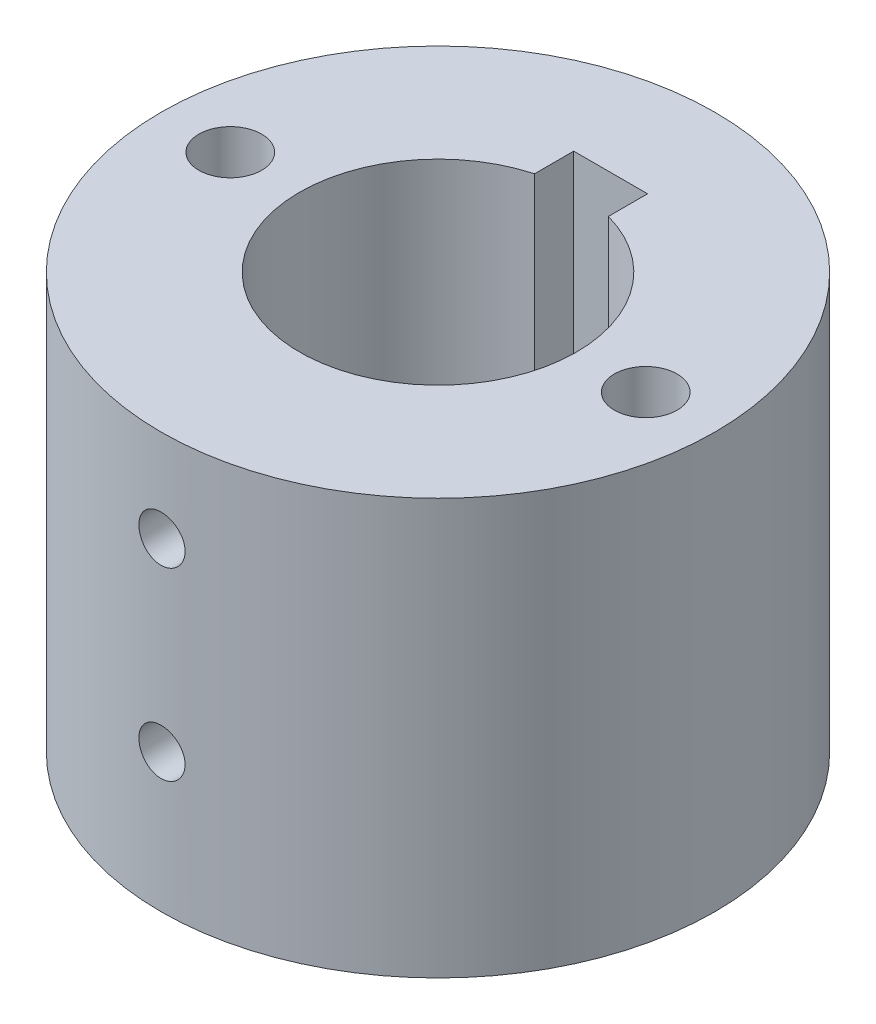
ISO-10303-21;
HEADER;
FILE_DESCRIPTION(('STEP AP214'),'2;1');
FILE_NAME('part.step','',(''),(''),'','','');
FILE_SCHEMA(('AUTOMOTIVE_DESIGN { 1 0 10303 214 1 1 1 1 }'));
ENDSEC;
DATA;
#1=APPLICATION_CONTEXT('core data for automotive mechanical design processes');
#2=APPLICATION_PROTOCOL_DEFINITION('international standard','automotive_design',2000,#1);
#3=PRODUCT_CONTEXT('',#1,'mechanical');
#4=PRODUCT('Part','Part','',(#3));
#5=PRODUCT_RELATED_PRODUCT_CATEGORY('part','',(#4));
#6=PRODUCT_DEFINITION_FORMATION('','',#4);
#7=PRODUCT_DEFINITION_CONTEXT('part definition',#1,'design');
#8=PRODUCT_DEFINITION('design','',#6,#7);
#9=PRODUCT_DEFINITION_SHAPE('','',#8);
#10=(LENGTH_UNIT() NAMED_UNIT(*) SI_UNIT(.MILLI.,.METRE.));
#11=(NAMED_UNIT(*) PLANE_ANGLE_UNIT() SI_UNIT($,.RADIAN.));
#12=(NAMED_UNIT(*) SI_UNIT($,.STERADIAN.) SOLID_ANGLE_UNIT());
#13=UNCERTAINTY_MEASURE_WITH_UNIT(LENGTH_MEASURE(1.E-05),#10,'distance_accuracy_value','');
#14=(GEOMETRIC_REPRESENTATION_CONTEXT(3) GLOBAL_UNCERTAINTY_ASSIGNED_CONTEXT((#13)) GLOBAL_UNIT_ASSIGNED_CONTEXT((#10,
#11,#12)) REPRESENTATION_CONTEXT('',''));
#15=CARTESIAN_POINT('',(0.,0.,0.));
#16=DIRECTION('',(0.,0.,1.));
#17=DIRECTION('',(1.,0.,0.));
#18=AXIS2_PLACEMENT_3D('',#15,#16,#17);
#19=CARTESIAN_POINT('',(0.,45.,0.));
#20=DIRECTION('',(0.,1.,0.));
#21=DIRECTION('',(0.,0.,1.));
#22=AXIS2_PLACEMENT_3D('',#19,#20,#21);
#23=PLANE('',#22);
#24=DIRECTION('',(0.,0.,-1.));
#25=VECTOR('',#24,1.);
#26=CARTESIAN_POINT('',(4.,45.,-18.7));
#27=LINE('',#26,#25);
#28=CARTESIAN_POINT('',(4.,45.,-14.456832294801));
#29=VERTEX_POINT('',#28);
#30=CARTESIAN_POINT('',(4.,45.,-18.7));
#31=VERTEX_POINT('',#30);
#32=EDGE_CURVE('E86',#29,#31,#27,.T.);
#33=ORIENTED_EDGE('',*,*,#32,.F.);
#34=CARTESIAN_POINT('',(0.,45.,0.));
#35=DIRECTION('',(0.,1.,0.));
#36=DIRECTION('',(0.,0.,1.));
#37=AXIS2_PLACEMENT_3D('',#34,#35,#36);
#38=CIRCLE('',#37,15.);
#39=CARTESIAN_POINT('',(-4.,45.,-14.456832294801));
#40=VERTEX_POINT('',#39);
#41=EDGE_CURVE('E181',#40,#29,#38,.T.);
#42=ORIENTED_EDGE('',*,*,#41,.F.);
#43=DIRECTION('',(0.,0.,1.));
#44=VECTOR('',#43,1.);
#45=CARTESIAN_POINT('',(-4.,45.,-18.7));
#46=LINE('',#45,#44);
#47=CARTESIAN_POINT('',(-4.,45.,-18.7));
#48=VERTEX_POINT('',#47);
#49=EDGE_CURVE('E57',#48,#40,#46,.T.);
#50=ORIENTED_EDGE('',*,*,#49,.F.);
#51=DIRECTION('',(-1.,0.,0.));
#52=VECTOR('',#51,1.);
#53=CARTESIAN_POINT('',(-4.,45.,-18.7));
#54=LINE('',#53,#52);
#55=EDGE_CURVE('E104',#31,#48,#54,.T.);
#56=ORIENTED_EDGE('',*,*,#55,.F.);
#57=EDGE_LOOP('',(#33,#42,#50,#56));
#58=FACE_BOUND('',#57,.T.);
#59=CARTESIAN_POINT('',(22.5,45.,0.));
#60=DIRECTION('',(0.,1.,0.));
#61=DIRECTION('',(0.,0.,1.));
#62=AXIS2_PLACEMENT_3D('',#59,#60,#61);
#63=CIRCLE('',#62,3.4);
#64=CARTESIAN_POINT('',(22.5,45.,3.4));
#65=VERTEX_POINT('',#64);
#66=EDGE_CURVE('E194',#65,#65,#63,.T.);
#67=ORIENTED_EDGE('',*,*,#66,.F.);
#68=EDGE_LOOP('',(#67));
#69=FACE_BOUND('',#68,.T.);
#70=CARTESIAN_POINT('',(-22.5,45.,0.));
#71=DIRECTION('',(0.,1.,0.));
#72=DIRECTION('',(0.,0.,1.));
#73=AXIS2_PLACEMENT_3D('',#70,#71,#72);
#74=CIRCLE('',#73,3.4);
#75=CARTESIAN_POINT('',(-22.5,45.,3.4));
#76=VERTEX_POINT('',#75);
#77=EDGE_CURVE('E191',#76,#76,#74,.T.);
#78=ORIENTED_EDGE('',*,*,#77,.F.);
#79=EDGE_LOOP('',(#78));
#80=FACE_BOUND('',#79,.T.);
#81=CARTESIAN_POINT('',(0.,45.,0.));
#82=DIRECTION('',(0.,1.,0.));
#83=DIRECTION('',(0.,0.,1.));
#84=AXIS2_PLACEMENT_3D('',#81,#82,#83);
#85=CIRCLE('',#84,30.);
#86=CARTESIAN_POINT('',(0.,45.,30.));
#87=VERTEX_POINT('',#86);
#88=EDGE_CURVE('E178',#87,#87,#85,.T.);
#89=ORIENTED_EDGE('',*,*,#88,.T.);
#90=EDGE_LOOP('',(#89));
#91=FACE_BOUND('',#90,.T.);
#92=ADVANCED_FACE('F41',(#58,#69,#80,#91),#23,.T.);
#93=CARTESIAN_POINT('',(0.,0.,0.));
#94=DIRECTION('',(0.,1.,0.));
#95=DIRECTION('',(0.,0.,1.));
#96=AXIS2_PLACEMENT_3D('',#93,#94,#95);
#97=PLANE('',#96);
#98=CARTESIAN_POINT('',(0.,0.,0.));
#99=DIRECTION('',(0.,1.,0.));
#100=DIRECTION('',(0.,0.,1.));
#101=AXIS2_PLACEMENT_3D('',#98,#99,#100);
#102=CIRCLE('',#101,15.);
#103=CARTESIAN_POINT('',(-4.,0.,-14.456832294801));
#104=VERTEX_POINT('',#103);
#105=CARTESIAN_POINT('',(4.,0.,-14.456832294801));
#106=VERTEX_POINT('',#105);
#107=EDGE_CURVE('E102',#104,#106,#102,.T.);
#108=ORIENTED_EDGE('',*,*,#107,.T.);
#109=DIRECTION('',(0.,0.,-1.));
#110=VECTOR('',#109,1.);
#111=CARTESIAN_POINT('',(4.,0.,-18.7));
#112=LINE('',#111,#110);
#113=CARTESIAN_POINT('',(4.,0.,-18.7));
#114=VERTEX_POINT('',#113);
#115=EDGE_CURVE('E83',#106,#114,#112,.T.);
#116=ORIENTED_EDGE('',*,*,#115,.T.);
#117=DIRECTION('',(-1.,0.,0.));
#118=VECTOR('',#117,1.);
#119=CARTESIAN_POINT('',(-4.,0.,-18.7));
#120=LINE('',#119,#118);
#121=CARTESIAN_POINT('',(-4.,0.,-18.7));
#122=VERTEX_POINT('',#121);
#123=EDGE_CURVE('E94',#114,#122,#120,.T.);
#124=ORIENTED_EDGE('',*,*,#123,.T.);
#125=DIRECTION('',(0.,0.,1.));
#126=VECTOR('',#125,1.);
#127=CARTESIAN_POINT('',(-4.,0.,-18.7));
#128=LINE('',#127,#126);
#129=EDGE_CURVE('E91',#122,#104,#128,.T.);
#130=ORIENTED_EDGE('',*,*,#129,.T.);
#131=EDGE_LOOP('',(#108,#116,#124,#130));
#132=FACE_BOUND('',#131,.T.);
#133=CARTESIAN_POINT('',(0.,0.,0.));
#134=DIRECTION('',(0.,1.,0.));
#135=DIRECTION('',(0.,0.,1.));
#136=AXIS2_PLACEMENT_3D('',#133,#134,#135);
#137=CIRCLE('',#136,30.);
#138=CARTESIAN_POINT('',(0.,0.,30.));
#139=VERTEX_POINT('',#138);
#140=EDGE_CURVE('E145',#139,#139,#137,.T.);
#141=ORIENTED_EDGE('',*,*,#140,.F.);
#142=EDGE_LOOP('',(#141));
#143=FACE_BOUND('',#142,.T.);
#144=ADVANCED_FACE('F99',(#132,#143),#97,.F.);
#145=CARTESIAN_POINT('',(0.,45.,0.));
#146=DIRECTION('',(0.,-1.,0.));
#147=DIRECTION('',(0.,0.,-1.));
#148=AXIS2_PLACEMENT_3D('',#145,#146,#147);
#149=CYLINDRICAL_SURFACE('',#148,30.);
#150=CARTESIAN_POINT('',(2.5,35.,29.8956518577535));
#151=CARTESIAN_POINT('',(2.49999387707595,34.859835728024,29.895653240209));
#152=CARTESIAN_POINT('',(2.48817272989955,34.7195760346058,29.8966481995655));
#153=CARTESIAN_POINT('',(2.44118994768572,34.4429374491414,29.9005204937316));
#154=CARTESIAN_POINT('',(2.40600186590414,34.306563137181,29.9033999613783));
#155=CARTESIAN_POINT('',(2.31330996184382,34.0417420096867,29.9107128874002));
#156=CARTESIAN_POINT('',(2.25581879093882,33.9132907476126,29.9151454646401));
#157=CARTESIAN_POINT('',(2.12017517121364,33.6678920119752,29.9250640675404));
#158=CARTESIAN_POINT('',(2.04202713953173,33.5509420863624,29.9305498679176));
#159=CARTESIAN_POINT('',(1.86707134114509,33.3315349923334,29.9419726194871));
#160=CARTESIAN_POINT('',(1.77022150350469,33.2291114203426,29.9479105692257));
#161=CARTESIAN_POINT('',(1.56070030169023,33.0419530844049,29.9595594152693));
#162=CARTESIAN_POINT('',(1.44802824663419,32.957219093281,29.9652703016456));
#163=CARTESIAN_POINT('',(1.20986061327197,32.8077334633595,29.9758310126879));
#164=CARTESIAN_POINT('',(1.08434673031465,32.7430108920464,29.9806795804987));
#165=CARTESIAN_POINT('',(0.824186001246905,32.6355712722038,29.9889585943072));
#166=CARTESIAN_POINT('',(0.689539315040404,32.5928538385045,29.9923890651266));
#167=CARTESIAN_POINT('',(0.415269489869528,32.5307337903599,29.9974383863167));
#168=CARTESIAN_POINT('',(0.275658740580804,32.5112768222014,29.9990614594988));
#169=CARTESIAN_POINT('',(-0.00485570472454915,32.4960619920385,30.0003274183556));
#170=CARTESIAN_POINT('',(-0.145759376648873,32.5003036893252,29.999970340854));
#171=CARTESIAN_POINT('',(-0.424491378797039,32.5323213304484,29.9973197159698));
#172=CARTESIAN_POINT('',(-0.562326475181168,32.5600388245105,29.9950309780632));
#173=CARTESIAN_POINT('',(-0.831381165100617,32.6381303774052,29.9887799963655));
#174=CARTESIAN_POINT('',(-0.96260069567876,32.6885046518064,29.9848177366516));
#175=CARTESIAN_POINT('',(-1.21488540159214,32.8105449677964,29.9756571978073));
#176=CARTESIAN_POINT('',(-1.33593785664744,32.8822371864969,29.9704574006341));
#177=CARTESIAN_POINT('',(-1.56431333969343,33.0448593039466,29.9594061317313));
#178=CARTESIAN_POINT('',(-1.67163608912468,33.135789592914,29.9535546467843));
#179=CARTESIAN_POINT('',(-1.86984741195474,33.3346360998881,29.9418366186817));
#180=CARTESIAN_POINT('',(-1.96068504166257,33.442603107047,29.9359700838166));
#181=CARTESIAN_POINT('',(-2.12295399730677,33.6722812627908,29.9249010443095));
#182=CARTESIAN_POINT('',(-2.19438530724579,33.7939924227054,29.9196985402148));
#183=CARTESIAN_POINT('',(-2.31581201148313,34.0477397194295,29.9105456524246));
#184=CARTESIAN_POINT('',(-2.36580476183676,34.1797771273672,29.9065954231836));
#185=CARTESIAN_POINT('',(-2.44289751757127,34.4504117951275,29.9003973319995));
#186=CARTESIAN_POINT('',(-2.46999800423701,34.5890089169745,29.898149434267));
#187=CARTESIAN_POINT('',(-2.50047245728154,34.8683829663882,29.8956163224134));
#188=CARTESIAN_POINT('',(-2.50391746529472,35.0091520936172,29.895325231706));
#189=CARTESIAN_POINT('',(-2.48716926261205,35.2892658591241,29.8967231803454));
#190=CARTESIAN_POINT('',(-2.46697627239705,35.4286105106764,29.898412201223));
#191=CARTESIAN_POINT('',(-2.4035845031062,35.7017158894989,29.9035747036187));
#192=CARTESIAN_POINT('',(-2.36041887747363,35.8354843649077,29.9070456133118));
#193=CARTESIAN_POINT('',(-2.2523408555746,36.0938802054094,29.9153786744903));
#194=CARTESIAN_POINT('',(-2.18742811036767,36.2185074237882,29.9202408482989));
#195=CARTESIAN_POINT('',(-2.03751871994737,36.4554081305482,29.9308228365796));
#196=CARTESIAN_POINT('',(-1.95247473421259,36.5676515709961,29.9365446608352));
#197=CARTESIAN_POINT('',(-1.76478532103877,36.7762948522671,29.9481944443445));
#198=CARTESIAN_POINT('',(-1.66213959072317,36.8726944204058,29.9541224071439));
#199=CARTESIAN_POINT('',(-1.44185343227936,37.0471560144251,29.9655340277207));
#200=CARTESIAN_POINT('',(-1.32417638102458,37.1251718825078,29.9710165449519));
#201=CARTESIAN_POINT('',(-1.07735048303601,37.2603347839114,29.9809030967764));
#202=CARTESIAN_POINT('',(-0.94820175095444,37.3174820257718,29.9853071421468));
#203=CARTESIAN_POINT('',(-0.682263946917593,37.4092062060402,29.9925352804838));
#204=CARTESIAN_POINT('',(-0.545484776301513,37.4438116878646,29.9953613708791));
#205=CARTESIAN_POINT('',(-0.268032947665744,37.4895633143852,29.9991232832458));
#206=CARTESIAN_POINT('',(-0.127360363394569,37.5007099031289,30.0000591409968));
#207=CARTESIAN_POINT('',(0.153430120989758,37.4992221509976,29.9999351968345));
#208=CARTESIAN_POINT('',(0.293548410528468,37.4866597454036,29.9988814316171));
#209=CARTESIAN_POINT('',(0.569677780153337,37.4382606137212,29.9949085848886));
#210=CARTESIAN_POINT('',(0.705688854660704,37.4024238560207,29.9919895008438));
#211=CARTESIAN_POINT('',(0.969747616121882,37.3085115746941,29.9846135425984));
#212=CARTESIAN_POINT('',(1.09779576530065,37.2504373432926,29.9801567577553));
#213=CARTESIAN_POINT('',(1.34233643224756,37.1137068865058,29.9702039990198));
#214=CARTESIAN_POINT('',(1.45882913271515,37.035050986602,29.9647080415613));
#215=CARTESIAN_POINT('',(1.67732022356365,36.8591199628773,29.9532739625408));
#216=CARTESIAN_POINT('',(1.77927568996154,36.7617916116336,29.9473346073371));
#217=CARTESIAN_POINT('',(1.96544456639886,36.5513745781851,29.9356936245053));
#218=CARTESIAN_POINT('',(2.04965367362058,36.4382820847928,29.9299920547994));
#219=CARTESIAN_POINT('',(2.19805344744714,36.1993274982476,29.9194606102169));
#220=CARTESIAN_POINT('',(2.26220630864616,36.0734418749969,29.9146323887052));
#221=CARTESIAN_POINT('',(2.36838225233449,35.8127314081635,29.9064144901315));
#222=CARTESIAN_POINT('',(2.41043077732367,35.6779170439569,29.9030231600575));
#223=CARTESIAN_POINT('',(2.46049524501522,35.451922789432,29.8989352047016));
#224=CARTESIAN_POINT('',(2.47528983514609,35.3621963680536,29.8977096097263));
#225=CARTESIAN_POINT('',(2.49504418376665,35.1816599920629,29.8960674893075));
#226=CARTESIAN_POINT('',(2.50000396868538,35.090850040363,29.8956509616896));
#227=CARTESIAN_POINT('',(2.5,35.,29.8956518577535));
#228=B_SPLINE_CURVE_WITH_KNOTS('',3,(#150,#151,#152,#153,#154,#155,#156,#157,#158,#159,#160,
#161,#162,#163,#164,#165,#166,#167,#168,#169,#170,#171,#172,#173,#174,#175,#176,#177,#178,#179,
#180,#181,#182,#183,#184,#185,#186,#187,#188,#189,#190,#191,#192,#193,#194,#195,#196,#197,#198,
#199,#200,#201,#202,#203,#204,#205,#206,#207,#208,#209,#210,#211,#212,#213,#214,#215,#216,#217,
#218,#219,#220,#221,#222,#223,#224,#225,#226,#227),.UNSPECIFIED.,.T.,.F.,(4,2,2,2,2,2,2,2,2,2,2,
2,2,2,2,2,2,2,2,2,2,2,2,2,2,2,2,2,2,2,2,2,2,2,2,2,2,2,4),(0.,0.420161105126486,
0.840798561792934,1.26119776094298,1.68150713708956,2.10277327972937,2.52405782280752,
2.94595145651181,3.36783770529444,3.78873617555057,4.20962681865261,4.62947260311709,
5.04932238229939,5.46968985502513,5.89006585515619,6.31171960057015,6.73337369356767,
7.15507977278702,7.57677698587607,7.99720721074768,8.4176335141337,8.83745470924517,
9.25728264086364,9.67810782107513,10.0989402432321,10.5208182934246,10.9426921276866,
11.3640307220251,11.7853613408799,12.2054156584349,12.62547054652,13.0455010288207,
13.4655248690968,13.8867643080924,14.3081057644345,14.7302367134679,15.1518807121846,
15.42421656069,15.6965516773469),.UNSPECIFIED.);
#229=CARTESIAN_POINT('',(2.5,35.,29.8956518577535));
#230=VERTEX_POINT('',#229);
#231=EDGE_CURVE('E120',#230,#230,#228,.T.);
#232=ORIENTED_EDGE('',*,*,#231,.T.);
#233=EDGE_LOOP('',(#232));
#234=FACE_BOUND('',#233,.T.);
#235=CARTESIAN_POINT('',(2.5,15.,29.8956518577535));
#236=CARTESIAN_POINT('',(2.49999387707595,14.859835728024,29.895653240209));
#237=CARTESIAN_POINT('',(2.48817272989955,14.7195760346058,29.8966481995655));
#238=CARTESIAN_POINT('',(2.44118994768572,14.4429374491414,29.9005204937316));
#239=CARTESIAN_POINT('',(2.40600186590414,14.306563137181,29.9033999613783));
#240=CARTESIAN_POINT('',(2.31330996184382,14.0417420096867,29.9107128874002));
#241=CARTESIAN_POINT('',(2.25581879093882,13.9132907476126,29.9151454646401));
#242=CARTESIAN_POINT('',(2.12017517121364,13.6678920119752,29.9250640675404));
#243=CARTESIAN_POINT('',(2.04202713953173,13.5509420863624,29.9305498679176));
#244=CARTESIAN_POINT('',(1.86707134114509,13.3315349923334,29.9419726194871));
#245=CARTESIAN_POINT('',(1.77022150350469,13.2291114203426,29.9479105692257));
#246=CARTESIAN_POINT('',(1.56070030169023,13.0419530844049,29.9595594152693));
#247=CARTESIAN_POINT('',(1.44802824663419,12.957219093281,29.9652703016456));
#248=CARTESIAN_POINT('',(1.20986061327197,12.8077334633595,29.9758310126879));
#249=CARTESIAN_POINT('',(1.08434673031465,12.7430108920464,29.9806795804987));
#250=CARTESIAN_POINT('',(0.824186001246906,12.6355712722038,29.9889585943072));
#251=CARTESIAN_POINT('',(0.689539315040403,12.5928538385045,29.9923890651266));
#252=CARTESIAN_POINT('',(0.415269489869526,12.5307337903599,29.9974383863167));
#253=CARTESIAN_POINT('',(0.275658740580803,12.5112768222014,29.9990614594988));
#254=CARTESIAN_POINT('',(-0.00485570472454866,12.4960619920385,30.0003274183556));
#255=CARTESIAN_POINT('',(-0.145759376648872,12.5003036893252,29.999970340854));
#256=CARTESIAN_POINT('',(-0.424491378797037,12.5323213304484,29.9973197159698));
#257=CARTESIAN_POINT('',(-0.562326475181165,12.5600388245105,29.9950309780632));
#258=CARTESIAN_POINT('',(-0.831381165100614,12.6381303774052,29.9887799963655));
#259=CARTESIAN_POINT('',(-0.962600695678757,12.6885046518064,29.9848177366516));
#260=CARTESIAN_POINT('',(-1.21488540159214,12.8105449677964,29.9756571978073));
#261=CARTESIAN_POINT('',(-1.33593785664744,12.8822371864969,29.9704574006341));
#262=CARTESIAN_POINT('',(-1.56431333969343,13.0448593039465,29.9594061317313));
#263=CARTESIAN_POINT('',(-1.67163608912468,13.135789592914,29.9535546467843));
#264=CARTESIAN_POINT('',(-1.86984741195474,13.3346360998881,29.9418366186817));
#265=CARTESIAN_POINT('',(-1.96068504166257,13.442603107047,29.9359700838166));
#266=CARTESIAN_POINT('',(-2.12295399730676,13.6722812627908,29.9249010443095));
#267=CARTESIAN_POINT('',(-2.19438530724579,13.7939924227054,29.9196985402148));
#268=CARTESIAN_POINT('',(-2.31581201148313,14.0477397194295,29.9105456524246));
#269=CARTESIAN_POINT('',(-2.36580476183675,14.1797771273672,29.9065954231836));
#270=CARTESIAN_POINT('',(-2.44289751757127,14.4504117951275,29.9003973319995));
#271=CARTESIAN_POINT('',(-2.46999800423701,14.5890089169745,29.898149434267));
#272=CARTESIAN_POINT('',(-2.50047245728154,14.8683829663882,29.8956163224134));
#273=CARTESIAN_POINT('',(-2.50391746529472,15.0091520936172,29.895325231706));
#274=CARTESIAN_POINT('',(-2.48716926261205,15.2892658591241,29.8967231803454));
#275=CARTESIAN_POINT('',(-2.46697627239705,15.4286105106764,29.898412201223));
#276=CARTESIAN_POINT('',(-2.4035845031062,15.7017158894989,29.9035747036187));
#277=CARTESIAN_POINT('',(-2.36041887747363,15.8354843649077,29.9070456133118));
#278=CARTESIAN_POINT('',(-2.2523408555746,16.0938802054094,29.9153786744903));
#279=CARTESIAN_POINT('',(-2.18742811036767,16.2185074237882,29.9202408482989));
#280=CARTESIAN_POINT('',(-2.03751871994737,16.4554081305482,29.9308228365796));
#281=CARTESIAN_POINT('',(-1.95247473421259,16.5676515709961,29.9365446608352));
#282=CARTESIAN_POINT('',(-1.76478532103877,16.7762948522671,29.9481944443445));
#283=CARTESIAN_POINT('',(-1.66213959072317,16.8726944204058,29.9541224071439));
#284=CARTESIAN_POINT('',(-1.44185343227936,17.0471560144251,29.9655340277207));
#285=CARTESIAN_POINT('',(-1.32417638102457,17.1251718825078,29.9710165449519));
#286=CARTESIAN_POINT('',(-1.07735048303601,17.2603347839114,29.9809030967764));
#287=CARTESIAN_POINT('',(-0.94820175095444,17.3174820257718,29.9853071421468));
#288=CARTESIAN_POINT('',(-0.682263946917595,17.4092062060402,29.9925352804838));
#289=CARTESIAN_POINT('',(-0.545484776301515,17.4438116878646,29.9953613708791));
#290=CARTESIAN_POINT('',(-0.268032947665747,17.4895633143852,29.9991232832458));
#291=CARTESIAN_POINT('',(-0.127360363394571,17.5007099031289,30.0000591409968));
#292=CARTESIAN_POINT('',(0.153430120989756,17.4992221509976,29.9999351968345));
#293=CARTESIAN_POINT('',(0.293548410528466,17.4866597454036,29.9988814316171));
#294=CARTESIAN_POINT('',(0.569677780153335,17.4382606137212,29.9949085848886));
#295=CARTESIAN_POINT('',(0.705688854660703,17.4024238560207,29.9919895008438));
#296=CARTESIAN_POINT('',(0.969747616121879,17.3085115746941,29.9846135425984));
#297=CARTESIAN_POINT('',(1.09779576530065,17.2504373432926,29.9801567577553));
#298=CARTESIAN_POINT('',(1.34233643224755,17.1137068865058,29.9702039990198));
#299=CARTESIAN_POINT('',(1.45882913271514,17.035050986602,29.9647080415613));
#300=CARTESIAN_POINT('',(1.67732022356365,16.8591199628773,29.9532739625408));
#301=CARTESIAN_POINT('',(1.77927568996154,16.7617916116336,29.9473346073371));
#302=CARTESIAN_POINT('',(1.96544456639886,16.5513745781851,29.9356936245053));
#303=CARTESIAN_POINT('',(2.04965367362057,16.4382820847928,29.9299920547994));
#304=CARTESIAN_POINT('',(2.19805344744714,16.1993274982476,29.9194606102169));
#305=CARTESIAN_POINT('',(2.26220630864616,16.0734418749969,29.9146323887052));
#306=CARTESIAN_POINT('',(2.36838225233449,15.8127314081635,29.9064144901315));
#307=CARTESIAN_POINT('',(2.41043077732367,15.6779170439569,29.9030231600575));
#308=CARTESIAN_POINT('',(2.46049524501522,15.451922789432,29.8989352047016));
#309=CARTESIAN_POINT('',(2.47528983514609,15.3621963680536,29.8977096097263));
#310=CARTESIAN_POINT('',(2.49504418376665,15.1816599920629,29.8960674893075));
#311=CARTESIAN_POINT('',(2.50000396868538,15.090850040363,29.8956509616896));
#312=CARTESIAN_POINT('',(2.5,15.,29.8956518577535));
#313=B_SPLINE_CURVE_WITH_KNOTS('',3,(#235,#236,#237,#238,#239,#240,#241,#242,#243,#244,#245,
#246,#247,#248,#249,#250,#251,#252,#253,#254,#255,#256,#257,#258,#259,#260,#261,#262,#263,#264,
#265,#266,#267,#268,#269,#270,#271,#272,#273,#274,#275,#276,#277,#278,#279,#280,#281,#282,#283,
#284,#285,#286,#287,#288,#289,#290,#291,#292,#293,#294,#295,#296,#297,#298,#299,#300,#301,#302,
#303,#304,#305,#306,#307,#308,#309,#310,#311,#312),.UNSPECIFIED.,.T.,.F.,(4,2,2,2,2,2,2,2,2,2,2,
2,2,2,2,2,2,2,2,2,2,2,2,2,2,2,2,2,2,2,2,2,2,2,2,2,2,2,4),(0.,0.420161105126486,
0.840798561792932,1.26119776094298,1.68150713708956,2.10277327972937,2.52405782280752,
2.94595145651181,3.36783770529444,3.78873617555057,4.20962681865261,4.62947260311708,
5.04932238229939,5.46968985502513,5.89006585515619,6.31171960057014,6.73337369356767,
7.15507977278701,7.57677698587607,7.99720721074768,8.4176335141337,8.83745470924516,
9.25728264086363,9.67810782107513,10.0989402432321,10.5208182934246,10.9426921276866,
11.3640307220251,11.7853613408799,12.2054156584349,12.62547054652,13.0455010288207,
13.4655248690968,13.8867643080923,14.3081057644345,14.7302367134679,15.1518807121846,
15.42421656069,15.6965516773468),.UNSPECIFIED.);
#314=CARTESIAN_POINT('',(2.5,15.,29.8956518577535));
#315=VERTEX_POINT('',#314);
#316=EDGE_CURVE('E112',#315,#315,#313,.T.);
#317=ORIENTED_EDGE('',*,*,#316,.T.);
#318=EDGE_LOOP('',(#317));
#319=FACE_BOUND('',#318,.T.);
#320=ORIENTED_EDGE('',*,*,#88,.F.);
#321=EDGE_LOOP('',(#320));
#322=FACE_BOUND('',#321,.T.);
#323=ORIENTED_EDGE('',*,*,#140,.T.);
#324=EDGE_LOOP('',(#323));
#325=FACE_BOUND('',#324,.T.);
#326=ADVANCED_FACE('F43',(#234,#319,#322,#325),#149,.T.);
#327=CARTESIAN_POINT('',(0.,45.,0.));
#328=DIRECTION('',(0.,-1.,0.));
#329=DIRECTION('',(0.,0.,-1.));
#330=AXIS2_PLACEMENT_3D('',#327,#328,#329);
#331=CYLINDRICAL_SURFACE('',#330,15.);
#332=DIRECTION('',(0.,-1.,0.));
#333=VECTOR('',#332,1.);
#334=CARTESIAN_POINT('',(4.,45.,-14.456832294801));
#335=LINE('',#334,#333);
#336=EDGE_CURVE('E11',#106,#29,#335,.F.);
#337=ORIENTED_EDGE('',*,*,#336,.F.);
#338=ORIENTED_EDGE('',*,*,#107,.F.);
#339=DIRECTION('',(0.,-1.,0.));
#340=VECTOR('',#339,1.);
#341=CARTESIAN_POINT('',(-4.,45.,-14.456832294801));
#342=LINE('',#341,#340);
#343=EDGE_CURVE('E50',#40,#104,#342,.T.);
#344=ORIENTED_EDGE('',*,*,#343,.F.);
#345=ORIENTED_EDGE('',*,*,#41,.T.);
#346=EDGE_LOOP('',(#337,#338,#344,#345));
#347=FACE_BOUND('',#346,.T.);
#348=CARTESIAN_POINT('',(2.5,35.,14.790199457749));
#349=CARTESIAN_POINT('',(2.49999439841983,34.8606242518382,14.790201973666));
#350=CARTESIAN_POINT('',(2.48830516902828,34.7211723939285,14.7921909238523));
#351=CARTESIAN_POINT('',(2.44187742806638,34.4461814567368,14.7999245720004));
#352=CARTESIAN_POINT('',(2.40711766030861,34.3106461062419,14.8056727334637));
#353=CARTESIAN_POINT('',(2.31562954367049,34.0475077166584,14.8202560936731));
#354=CARTESIAN_POINT('',(2.25891955493198,33.9198981513378,14.8290887118401));
#355=CARTESIAN_POINT('',(2.12518649688947,33.6760190452822,14.8488427210228));
#356=CARTESIAN_POINT('',(2.04816571350133,33.5597482304227,14.8597638769423));
#357=CARTESIAN_POINT('',(1.87518752696654,33.3406871502554,14.8825847115588));
#358=CARTESIAN_POINT('',(1.77906904893234,33.2380248686138,14.8944921732795));
#359=CARTESIAN_POINT('',(1.57097200469527,33.0502066931382,14.9178748066858));
#360=CARTESIAN_POINT('',(1.45899249914997,32.9650518368846,14.9293499527174));
#361=CARTESIAN_POINT('',(1.22152286994835,32.8141854327807,14.9506573698271));
#362=CARTESIAN_POINT('',(1.09595608145671,32.7485929922682,14.9604794243234));
#363=CARTESIAN_POINT('',(0.835395621723866,32.6394789294694,14.9772873695709));
#364=CARTESIAN_POINT('',(0.700402564078186,32.5959558721151,14.9842734447266));
#365=CARTESIAN_POINT('',(0.426143726344241,32.5326074650161,14.994567347244));
#366=CARTESIAN_POINT('',(0.286928886679269,32.5125670839953,14.9979085311091));
#367=CARTESIAN_POINT('',(0.00707528552579606,32.4960842458474,15.0006507934278));
#368=CARTESIAN_POINT('',(-0.133563378528899,32.4996401847528,15.0000521396931));
#369=CARTESIAN_POINT('',(-0.410802185078875,32.5300813515282,14.9950085843139));
#370=CARTESIAN_POINT('',(-0.547428530700139,32.5567351634092,14.990601836924));
#371=CARTESIAN_POINT('',(-0.814241979611789,32.6322510742465,14.9784797877164));
#372=CARTESIAN_POINT('',(-0.944428886651503,32.6811138495895,14.9707643851321));
#373=CARTESIAN_POINT('',(-1.19535614778265,32.7998906403153,14.9528269851196));
#374=CARTESIAN_POINT('',(-1.31605052301904,32.8699000120824,14.9425936732688));
#375=CARTESIAN_POINT('',(-1.54406552984664,33.028912822635,14.920757380715));
#376=CARTESIAN_POINT('',(-1.65138507791587,33.1179177987108,14.9091542891913));
#377=CARTESIAN_POINT('',(-1.85097127344666,33.3136788066193,14.885702682326));
#378=CARTESIAN_POINT('',(-1.94303950225321,33.420637094901,14.8738528973104));
#379=CARTESIAN_POINT('',(-2.10795458844807,33.6485870902158,14.8513795978481));
#380=CARTESIAN_POINT('',(-2.18080126853242,33.7695789266828,14.8407560947132));
#381=CARTESIAN_POINT('',(-2.30524443448829,34.0223916418775,14.8219375456182));
#382=CARTESIAN_POINT('',(-2.35681702727924,34.1542244980921,14.813745233026));
#383=CARTESIAN_POINT('',(-2.43702987081562,34.4248490723076,14.8007618868988));
#384=CARTESIAN_POINT('',(-2.46567214076796,34.5636401764324,14.7959705538832));
#385=CARTESIAN_POINT('',(-2.49893188487927,34.8424661561621,14.7903895942212));
#386=CARTESIAN_POINT('',(-2.50383220791244,34.9824663797021,14.7895528575867));
#387=CARTESIAN_POINT('',(-2.49022270268246,35.2612866716908,14.7918503478236));
#388=CARTESIAN_POINT('',(-2.47171377862467,35.400106785514,14.7949844213185));
#389=CARTESIAN_POINT('',(-2.4120523349281,35.6717277591909,14.8048268745502));
#390=CARTESIAN_POINT('',(-2.37104379064639,35.804561139878,14.8115125191835));
#391=CARTESIAN_POINT('',(-2.26769819019228,36.0614701662795,14.827685730055));
#392=CARTESIAN_POINT('',(-2.20535985810094,36.1855452875509,14.8371734639058));
#393=CARTESIAN_POINT('',(-2.06045667322923,36.4226745944061,14.8579912839739));
#394=CARTESIAN_POINT('',(-1.97771056415937,36.5356165727561,14.8693375560035));
#395=CARTESIAN_POINT('',(-1.79458946570798,36.746113532695,14.8925466667987));
#396=CARTESIAN_POINT('',(-1.69421323638405,36.8436674311097,14.9044095418533));
#397=CARTESIAN_POINT('',(-1.47742807032881,37.0216518927287,14.9274642211826));
#398=CARTESIAN_POINT('',(-1.3608632533862,37.1018938262845,14.9386477634467));
#399=CARTESIAN_POINT('',(-1.11574344794933,37.2416553270049,14.9589511243294));
#400=CARTESIAN_POINT('',(-0.987188847470629,37.3011755644739,14.9680710096998));
#401=CARTESIAN_POINT('',(-0.72229905150133,37.3975105839549,14.9831835816958));
#402=CARTESIAN_POINT('',(-0.586000562602613,37.4344240757349,14.9891898456762));
#403=CARTESIAN_POINT('',(-0.309030734874212,37.4848155989638,14.9974558316928));
#404=CARTESIAN_POINT('',(-0.168359756821621,37.4982955587324,14.9997158620019));
#405=CARTESIAN_POINT('',(0.111541275773676,37.5013818823122,15.0002303788781));
#406=CARTESIAN_POINT('',(0.250768160602665,37.4912752539411,14.9985330202419));
#407=CARTESIAN_POINT('',(0.525511974314706,37.4480960777306,14.9914217838733));
#408=CARTESIAN_POINT('',(0.66102892396748,37.4150236584903,14.9860079269518));
#409=CARTESIAN_POINT('',(0.924396445918538,37.3269618344563,14.972069888274));
#410=CARTESIAN_POINT('',(1.05225537215382,37.2719968317899,14.9635491704088));
#411=CARTESIAN_POINT('',(1.29698045298217,37.1417420637694,14.9443275687803));
#412=CARTESIAN_POINT('',(1.41384608611822,37.0664513349376,14.9336265816741));
#413=CARTESIAN_POINT('',(1.6347129455264,36.8966649075395,14.9110762961641));
#414=CARTESIAN_POINT('',(1.73855143060275,36.8019590452487,14.8992152454112));
#415=CARTESIAN_POINT('',(1.92896387595091,36.5964716920962,14.8757630331437));
#416=CARTESIAN_POINT('',(2.0155337867119,36.4856864410875,14.8641719354951));
#417=CARTESIAN_POINT('',(2.16951427091086,36.2502546775104,14.8424834353391));
#418=CARTESIAN_POINT('',(2.2367849890577,36.1255156602345,14.8323971784578));
#419=CARTESIAN_POINT('',(2.34931453640427,35.8663907641619,14.8149921009131));
#420=CARTESIAN_POINT('',(2.39459535522307,35.7320146773226,14.8076705172488));
#421=CARTESIAN_POINT('',(2.45202605312742,35.4975962305126,14.7982474485649));
#422=CARTESIAN_POINT('',(2.46998741767139,35.3989731920374,14.7952462341947));
#423=CARTESIAN_POINT('',(2.49397629518131,35.2002465151631,14.7912213528807));
#424=CARTESIAN_POINT('',(2.50000402479277,35.1001429036758,14.7901976500369));
#425=CARTESIAN_POINT('',(2.5,35.,14.790199457749));
#426=B_SPLINE_CURVE_WITH_KNOTS('',3,(#348,#349,#350,#351,#352,#353,#354,#355,#356,#357,#358,
#359,#360,#361,#362,#363,#364,#365,#366,#367,#368,#369,#370,#371,#372,#373,#374,#375,#376,#377,
#378,#379,#380,#381,#382,#383,#384,#385,#386,#387,#388,#389,#390,#391,#392,#393,#394,#395,#396,
#397,#398,#399,#400,#401,#402,#403,#404,#405,#406,#407,#408,#409,#410,#411,#412,#413,#414,#415,
#416,#417,#418,#419,#420,#421,#422,#423,#424,#425),.UNSPECIFIED.,.T.,.F.,(4,2,2,2,2,2,2,2,2,2,2,
2,2,2,2,2,2,2,2,2,2,2,2,2,2,2,2,2,2,2,2,2,2,2,2,2,2,2,4),(0.,0.417761038927743,0.83590751996297,
1.2537049978752,1.67145547405274,2.09289159155715,2.51435267834448,2.93832980111435,
3.36227935111113,3.78231567472566,4.20232344652692,4.61817121164668,5.03403164249533,
5.45179604139426,5.86959426226764,6.29246123462123,6.71533210746019,7.13867662498604,
7.56198385938077,7.98023542420411,8.39847083413976,8.81406064635491,9.22967532293574,
9.64912342762702,10.0686010443069,10.4924411303538,10.916267504767,11.3382298441765,
11.7601574591235,12.1769777626592,12.5937957321882,13.0101503983246,13.4265248039234,
13.8476699746325,14.2689137888181,14.6931372761832,15.1169356674445,15.4171067054377,
15.7172722940182),.UNSPECIFIED.);
#427=CARTESIAN_POINT('',(2.5,35.,14.790199457749));
#428=VERTEX_POINT('',#427);
#429=EDGE_CURVE('E119',#428,#428,#426,.T.);
#430=ORIENTED_EDGE('',*,*,#429,.F.);
#431=EDGE_LOOP('',(#430));
#432=FACE_BOUND('',#431,.T.);
#433=CARTESIAN_POINT('',(2.5,15.,14.790199457749));
#434=CARTESIAN_POINT('',(2.49999439841983,14.8606242518382,14.790201973666));
#435=CARTESIAN_POINT('',(2.48830516902828,14.7211723939285,14.7921909238523));
#436=CARTESIAN_POINT('',(2.44187742806638,14.4461814567368,14.7999245720004));
#437=CARTESIAN_POINT('',(2.40711766030861,14.3106461062419,14.8056727334637));
#438=CARTESIAN_POINT('',(2.31562954367049,14.0475077166584,14.8202560936731));
#439=CARTESIAN_POINT('',(2.25891955493199,13.9198981513378,14.8290887118401));
#440=CARTESIAN_POINT('',(2.12518649688947,13.6760190452822,14.8488427210228));
#441=CARTESIAN_POINT('',(2.04816571350133,13.5597482304227,14.8597638769423));
#442=CARTESIAN_POINT('',(1.87518752696654,13.3406871502554,14.8825847115588));
#443=CARTESIAN_POINT('',(1.77906904893234,13.2380248686138,14.8944921732795));
#444=CARTESIAN_POINT('',(1.57097200469527,13.0502066931382,14.9178748066858));
#445=CARTESIAN_POINT('',(1.45899249914997,12.9650518368846,14.9293499527174));
#446=CARTESIAN_POINT('',(1.22152286994836,12.8141854327807,14.9506573698271));
#447=CARTESIAN_POINT('',(1.09595608145671,12.7485929922682,14.9604794243234));
#448=CARTESIAN_POINT('',(0.835395621723869,12.6394789294694,14.9772873695709));
#449=CARTESIAN_POINT('',(0.700402564078188,12.5959558721151,14.9842734447266));
#450=CARTESIAN_POINT('',(0.426143726344242,12.5326074650161,14.994567347244));
#451=CARTESIAN_POINT('',(0.286928886679271,12.5125670839953,14.9979085311091));
#452=CARTESIAN_POINT('',(0.00707528552579728,12.4960842458474,15.0006507934278));
#453=CARTESIAN_POINT('',(-0.133563378528898,12.4996401847528,15.0000521396931));
#454=CARTESIAN_POINT('',(-0.410802185078876,12.5300813515282,14.9950085843139));
#455=CARTESIAN_POINT('',(-0.547428530700141,12.5567351634092,14.990601836924));
#456=CARTESIAN_POINT('',(-0.814241979611791,12.6322510742465,14.9784797877164));
#457=CARTESIAN_POINT('',(-0.944428886651504,12.6811138495895,14.9707643851321));
#458=CARTESIAN_POINT('',(-1.19535614778265,12.7998906403153,14.9528269851196));
#459=CARTESIAN_POINT('',(-1.31605052301905,12.8699000120824,14.9425936732688));
#460=CARTESIAN_POINT('',(-1.54406552984664,13.028912822635,14.920757380715));
#461=CARTESIAN_POINT('',(-1.65138507791588,13.1179177987108,14.9091542891913));
#462=CARTESIAN_POINT('',(-1.85097127344667,13.3136788066193,14.885702682326));
#463=CARTESIAN_POINT('',(-1.94303950225321,13.420637094901,14.8738528973104));
#464=CARTESIAN_POINT('',(-2.10795458844806,13.6485870902158,14.8513795978481));
#465=CARTESIAN_POINT('',(-2.18080126853242,13.7695789266828,14.8407560947132));
#466=CARTESIAN_POINT('',(-2.30524443448829,14.0223916418775,14.8219375456182));
#467=CARTESIAN_POINT('',(-2.35681702727924,14.1542244980921,14.813745233026));
#468=CARTESIAN_POINT('',(-2.43702987081562,14.4248490723075,14.8007618868988));
#469=CARTESIAN_POINT('',(-2.46567214076796,14.5636401764324,14.7959705538832));
#470=CARTESIAN_POINT('',(-2.49893188487927,14.8424661561621,14.7903895942212));
#471=CARTESIAN_POINT('',(-2.50383220791244,14.9824663797021,14.7895528575867));
#472=CARTESIAN_POINT('',(-2.49022270268246,15.2612866716908,14.7918503478236));
#473=CARTESIAN_POINT('',(-2.47171377862467,15.400106785514,14.7949844213185));
#474=CARTESIAN_POINT('',(-2.4120523349281,15.6717277591909,14.8048268745502));
#475=CARTESIAN_POINT('',(-2.37104379064639,15.804561139878,14.8115125191835));
#476=CARTESIAN_POINT('',(-2.26769819019228,16.0614701662795,14.827685730055));
#477=CARTESIAN_POINT('',(-2.20535985810094,16.1855452875509,14.8371734639058));
#478=CARTESIAN_POINT('',(-2.06045667322923,16.4226745944061,14.8579912839739));
#479=CARTESIAN_POINT('',(-1.97771056415936,16.5356165727561,14.8693375560035));
#480=CARTESIAN_POINT('',(-1.79458946570798,16.746113532695,14.8925466667987));
#481=CARTESIAN_POINT('',(-1.69421323638404,16.8436674311097,14.9044095418533));
#482=CARTESIAN_POINT('',(-1.47742807032881,17.0216518927287,14.9274642211826));
#483=CARTESIAN_POINT('',(-1.3608632533862,17.1018938262845,14.9386477634467));
#484=CARTESIAN_POINT('',(-1.11574344794933,17.2416553270049,14.9589511243294));
#485=CARTESIAN_POINT('',(-0.987188847470627,17.3011755644738,14.9680710096998));
#486=CARTESIAN_POINT('',(-0.722299051501328,17.3975105839549,14.9831835816958));
#487=CARTESIAN_POINT('',(-0.586000562602611,17.4344240757349,14.9891898456762));
#488=CARTESIAN_POINT('',(-0.309030734874211,17.4848155989638,14.9974558316928));
#489=CARTESIAN_POINT('',(-0.168359756821621,17.4982955587324,14.9997158620019));
#490=CARTESIAN_POINT('',(0.111541275773676,17.5013818823122,15.0002303788781));
#491=CARTESIAN_POINT('',(0.250768160602664,17.4912752539411,14.9985330202419));
#492=CARTESIAN_POINT('',(0.525511974314705,17.4480960777306,14.9914217838733));
#493=CARTESIAN_POINT('',(0.661028923967479,17.4150236584903,14.9860079269518));
#494=CARTESIAN_POINT('',(0.924396445918537,17.3269618344563,14.972069888274));
#495=CARTESIAN_POINT('',(1.05225537215382,17.27199683179,14.9635491704088));
#496=CARTESIAN_POINT('',(1.29698045298217,17.1417420637694,14.9443275687803));
#497=CARTESIAN_POINT('',(1.41384608611822,17.0664513349376,14.9336265816741));
#498=CARTESIAN_POINT('',(1.6347129455264,16.8966649075395,14.9110762961641));
#499=CARTESIAN_POINT('',(1.73855143060275,16.8019590452487,14.8992152454112));
#500=CARTESIAN_POINT('',(1.92896387595091,16.5964716920962,14.8757630331437));
#501=CARTESIAN_POINT('',(2.0155337867119,16.4856864410875,14.8641719354951));
#502=CARTESIAN_POINT('',(2.16951427091086,16.2502546775104,14.8424834353391));
#503=CARTESIAN_POINT('',(2.2367849890577,16.1255156602345,14.8323971784578));
#504=CARTESIAN_POINT('',(2.34931453640427,15.8663907641618,14.8149921009131));
#505=CARTESIAN_POINT('',(2.39459535522307,15.7320146773226,14.8076705172488));
#506=CARTESIAN_POINT('',(2.45202605312742,15.4975962305126,14.7982474485649));
#507=CARTESIAN_POINT('',(2.46998741767139,15.3989731920374,14.7952462341947));
#508=CARTESIAN_POINT('',(2.49397629518131,15.2002465151631,14.7912213528807));
#509=CARTESIAN_POINT('',(2.50000402479277,15.1001429036758,14.7901976500369));
#510=CARTESIAN_POINT('',(2.5,15.,14.790199457749));
#511=B_SPLINE_CURVE_WITH_KNOTS('',3,(#433,#434,#435,#436,#437,#438,#439,#440,#441,#442,#443,
#444,#445,#446,#447,#448,#449,#450,#451,#452,#453,#454,#455,#456,#457,#458,#459,#460,#461,#462,
#463,#464,#465,#466,#467,#468,#469,#470,#471,#472,#473,#474,#475,#476,#477,#478,#479,#480,#481,
#482,#483,#484,#485,#486,#487,#488,#489,#490,#491,#492,#493,#494,#495,#496,#497,#498,#499,#500,
#501,#502,#503,#504,#505,#506,#507,#508,#509,#510),.UNSPECIFIED.,.T.,.F.,(4,2,2,2,2,2,2,2,2,2,2,
2,2,2,2,2,2,2,2,2,2,2,2,2,2,2,2,2,2,2,2,2,2,2,2,2,2,2,4),(0.,0.41776103892774,0.83590751996297,
1.25370499787519,1.67145547405274,2.09289159155714,2.51435267834447,2.93832980111435,
3.36227935111113,3.78231567472565,4.20232344652692,4.61817121164668,5.03403164249533,
5.45179604139425,5.86959426226764,6.29246123462123,6.71533210746019,7.13867662498604,
7.56198385938077,7.98023542420411,8.39847083413976,8.81406064635491,9.22967532293574,
9.64912342762702,10.0686010443069,10.4924411303538,10.916267504767,11.3382298441765,
11.7601574591235,12.1769777626592,12.5937957321882,13.0101503983246,13.4265248039234,
13.8476699746325,14.2689137888181,14.6931372761832,15.1169356674445,15.4171067054376,
15.7172722940182),.UNSPECIFIED.);
#512=CARTESIAN_POINT('',(2.5,15.,14.790199457749));
#513=VERTEX_POINT('',#512);
#514=EDGE_CURVE('E110',#513,#513,#511,.T.);
#515=ORIENTED_EDGE('',*,*,#514,.F.);
#516=EDGE_LOOP('',(#515));
#517=FACE_BOUND('',#516,.T.);
#518=ADVANCED_FACE('F150',(#347,#432,#517),#331,.F.);
#519=CARTESIAN_POINT('',(-22.5,30.,0.));
#520=DIRECTION('',(0.,1.,0.));
#521=DIRECTION('',(0.,0.,1.));
#522=AXIS2_PLACEMENT_3D('',#519,#520,#521);
#523=CYLINDRICAL_SURFACE('',#522,3.4);
#524=CARTESIAN_POINT('',(-22.5,30.,0.));
#525=DIRECTION('',(0.,1.,0.));
#526=DIRECTION('',(0.,0.,1.));
#527=AXIS2_PLACEMENT_3D('',#524,#525,#526);
#528=CIRCLE('',#527,3.4);
#529=CARTESIAN_POINT('',(-22.5,30.,3.4));
#530=VERTEX_POINT('',#529);
#531=EDGE_CURVE('E188',#530,#530,#528,.T.);
#532=ORIENTED_EDGE('',*,*,#531,.F.);
#533=EDGE_LOOP('',(#532));
#534=FACE_BOUND('',#533,.T.);
#535=ORIENTED_EDGE('',*,*,#77,.T.);
#536=EDGE_LOOP('',(#535));
#537=FACE_BOUND('',#536,.T.);
#538=ADVANCED_FACE('F155',(#534,#537),#523,.F.);
#539=CARTESIAN_POINT('',(-22.5,30.,0.));
#540=DIRECTION('',(0.,1.,0.));
#541=DIRECTION('',(0.,0.,1.));
#542=AXIS2_PLACEMENT_3D('',#539,#540,#541);
#543=PLANE('',#542);
#544=ORIENTED_EDGE('',*,*,#531,.T.);
#545=EDGE_LOOP('',(#544));
#546=FACE_BOUND('',#545,.T.);
#547=ADVANCED_FACE('F157',(#546),#543,.T.);
#548=CARTESIAN_POINT('',(22.5,30.,0.));
#549=DIRECTION('',(0.,1.,0.));
#550=DIRECTION('',(0.,0.,1.));
#551=AXIS2_PLACEMENT_3D('',#548,#549,#550);
#552=CYLINDRICAL_SURFACE('',#551,3.4);
#553=CARTESIAN_POINT('',(22.5,30.,0.));
#554=DIRECTION('',(0.,1.,0.));
#555=DIRECTION('',(0.,0.,1.));
#556=AXIS2_PLACEMENT_3D('',#553,#554,#555);
#557=CIRCLE('',#556,3.4);
#558=CARTESIAN_POINT('',(22.5,30.,3.4));
#559=VERTEX_POINT('',#558);
#560=EDGE_CURVE('E185',#559,#559,#557,.T.);
#561=ORIENTED_EDGE('',*,*,#560,.F.);
#562=EDGE_LOOP('',(#561));
#563=FACE_BOUND('',#562,.T.);
#564=ORIENTED_EDGE('',*,*,#66,.T.);
#565=EDGE_LOOP('',(#564));
#566=FACE_BOUND('',#565,.T.);
#567=ADVANCED_FACE('F200',(#563,#566),#552,.F.);
#568=CARTESIAN_POINT('',(22.5,30.,0.));
#569=DIRECTION('',(0.,1.,0.));
#570=DIRECTION('',(0.,0.,1.));
#571=AXIS2_PLACEMENT_3D('',#568,#569,#570);
#572=PLANE('',#571);
#573=ORIENTED_EDGE('',*,*,#560,.T.);
#574=EDGE_LOOP('',(#573));
#575=FACE_BOUND('',#574,.T.);
#576=ADVANCED_FACE('F131',(#575),#572,.T.);
#577=CARTESIAN_POINT('',(0.,15.,6.99999999999999));
#578=DIRECTION('',(0.,0.,1.));
#579=DIRECTION('',(1.,0.,0.));
#580=AXIS2_PLACEMENT_3D('',#577,#578,#579);
#581=CYLINDRICAL_SURFACE('',#580,2.5);
#582=ORIENTED_EDGE('',*,*,#514,.T.);
#583=EDGE_LOOP('',(#582));
#584=FACE_BOUND('',#583,.T.);
#585=ORIENTED_EDGE('',*,*,#316,.F.);
#586=EDGE_LOOP('',(#585));
#587=FACE_BOUND('',#586,.T.);
#588=ADVANCED_FACE('F126',(#584,#587),#581,.F.);
#589=CARTESIAN_POINT('',(0.,35.,6.99999999999999));
#590=DIRECTION('',(0.,0.,1.));
#591=DIRECTION('',(1.,0.,0.));
#592=AXIS2_PLACEMENT_3D('',#589,#590,#591);
#593=CYLINDRICAL_SURFACE('',#592,2.5);
#594=ORIENTED_EDGE('',*,*,#429,.T.);
#595=EDGE_LOOP('',(#594));
#596=FACE_BOUND('',#595,.T.);
#597=ORIENTED_EDGE('',*,*,#231,.F.);
#598=EDGE_LOOP('',(#597));
#599=FACE_BOUND('',#598,.T.);
#600=ADVANCED_FACE('F130',(#596,#599),#593,.F.);
#601=CARTESIAN_POINT('',(4.,0.,-18.7));
#602=DIRECTION('',(1.,0.,0.));
#603=DIRECTION('',(0.,0.,-1.));
#604=AXIS2_PLACEMENT_3D('',#601,#602,#603);
#605=PLANE('',#604);
#606=ORIENTED_EDGE('',*,*,#336,.T.);
#607=ORIENTED_EDGE('',*,*,#32,.T.);
#608=DIRECTION('',(0.,1.,0.));
#609=VECTOR('',#608,1.);
#610=CARTESIAN_POINT('',(4.,0.,-18.7));
#611=LINE('',#610,#609);
#612=EDGE_CURVE('E79',#114,#31,#611,.T.);
#613=ORIENTED_EDGE('',*,*,#612,.F.);
#614=ORIENTED_EDGE('',*,*,#115,.F.);
#615=EDGE_LOOP('',(#606,#607,#613,#614));
#616=FACE_BOUND('',#615,.T.);
#617=ADVANCED_FACE('F81',(#616),#605,.F.);
#618=CARTESIAN_POINT('',(-4.,0.,-18.7));
#619=DIRECTION('',(-1.,0.,0.));
#620=DIRECTION('',(0.,0.,1.));
#621=AXIS2_PLACEMENT_3D('',#618,#619,#620);
#622=PLANE('',#621);
#623=ORIENTED_EDGE('',*,*,#343,.T.);
#624=ORIENTED_EDGE('',*,*,#129,.F.);
#625=DIRECTION('',(0.,1.,0.));
#626=VECTOR('',#625,1.);
#627=CARTESIAN_POINT('',(-4.,0.,-18.7));
#628=LINE('',#627,#626);
#629=EDGE_CURVE('E90',#122,#48,#628,.T.);
#630=ORIENTED_EDGE('',*,*,#629,.T.);
#631=ORIENTED_EDGE('',*,*,#49,.T.);
#632=EDGE_LOOP('',(#623,#624,#630,#631));
#633=FACE_BOUND('',#632,.T.);
#634=ADVANCED_FACE('F252',(#633),#622,.F.);
#635=CARTESIAN_POINT('',(-4.,0.,-18.7));
#636=DIRECTION('',(0.,0.,-1.));
#637=DIRECTION('',(-1.,0.,0.));
#638=AXIS2_PLACEMENT_3D('',#635,#636,#637);
#639=PLANE('',#638);
#640=ORIENTED_EDGE('',*,*,#55,.T.);
#641=ORIENTED_EDGE('',*,*,#629,.F.);
#642=ORIENTED_EDGE('',*,*,#123,.F.);
#643=ORIENTED_EDGE('',*,*,#612,.T.);
#644=EDGE_LOOP('',(#640,#641,#642,#643));
#645=FACE_BOUND('',#644,.T.);
#646=ADVANCED_FACE('F95',(#645),#639,.F.);
#647=CLOSED_SHELL('',(#92,#144,#326,#518,#538,#547,#567,#576,#588,#600,#617,#634,#646));
#648=MANIFOLD_SOLID_BREP('B2',#647);
#649=ADVANCED_BREP_SHAPE_REPRESENTATION('',(#18,#648),#14);
#650=SHAPE_DEFINITION_REPRESENTATION(#9,#649);
ENDSEC;
END-ISO-10303-21;
